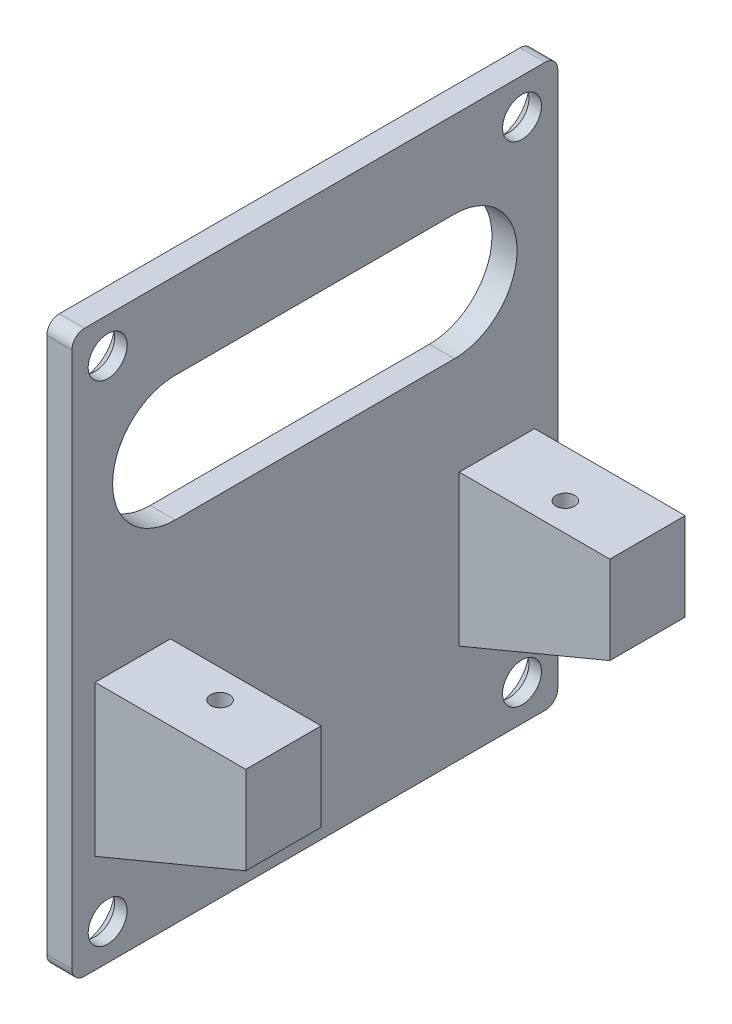
ISO-10303-21;
HEADER;
FILE_DESCRIPTION(('STEP AP214'),'2;1');
FILE_NAME('part.step','',(''),(''),'','','');
FILE_SCHEMA(('AUTOMOTIVE_DESIGN { 1 0 10303 214 1 1 1 1 }'));
ENDSEC;
DATA;
#1=APPLICATION_CONTEXT('core data for automotive mechanical design processes');
#2=APPLICATION_PROTOCOL_DEFINITION('international standard','automotive_design',2000,#1);
#3=PRODUCT_CONTEXT('',#1,'mechanical');
#4=PRODUCT('Part','Part','',(#3));
#5=PRODUCT_RELATED_PRODUCT_CATEGORY('part','',(#4));
#6=PRODUCT_DEFINITION_FORMATION('','',#4);
#7=PRODUCT_DEFINITION_CONTEXT('part definition',#1,'design');
#8=PRODUCT_DEFINITION('design','',#6,#7);
#9=PRODUCT_DEFINITION_SHAPE('','',#8);
#10=(LENGTH_UNIT() NAMED_UNIT(*) SI_UNIT(.MILLI.,.METRE.));
#11=(NAMED_UNIT(*) PLANE_ANGLE_UNIT() SI_UNIT($,.RADIAN.));
#12=(NAMED_UNIT(*) SI_UNIT($,.STERADIAN.) SOLID_ANGLE_UNIT());
#13=UNCERTAINTY_MEASURE_WITH_UNIT(LENGTH_MEASURE(1.E-05),#10,'distance_accuracy_value','');
#14=(GEOMETRIC_REPRESENTATION_CONTEXT(3) GLOBAL_UNCERTAINTY_ASSIGNED_CONTEXT((#13)) GLOBAL_UNIT_ASSIGNED_CONTEXT((#10,
#11,#12)) REPRESENTATION_CONTEXT('',''));
#15=CARTESIAN_POINT('',(0.,0.,0.));
#16=DIRECTION('',(0.,0.,1.));
#17=DIRECTION('',(1.,0.,0.));
#18=AXIS2_PLACEMENT_3D('',#15,#16,#17);
#19=CARTESIAN_POINT('',(2.,0.,0.));
#20=DIRECTION('',(1.,0.,0.));
#21=DIRECTION('',(0.,0.,-1.));
#22=AXIS2_PLACEMENT_3D('',#19,#20,#21);
#23=PLANE('',#22);
#24=DIRECTION('',(0.,1.,0.));
#25=VECTOR('',#24,1.);
#26=CARTESIAN_POINT('',(2.,-2.5,11.5));
#27=LINE('',#26,#25);
#28=CARTESIAN_POINT('',(2.,-14.5,11.5));
#29=VERTEX_POINT('',#28);
#30=CARTESIAN_POINT('',(2.,-2.5,11.5));
#31=VERTEX_POINT('',#30);
#32=EDGE_CURVE('E192',#29,#31,#27,.T.);
#33=ORIENTED_EDGE('',*,*,#32,.F.);
#34=DIRECTION('',(0.,0.,1.));
#35=VECTOR('',#34,1.);
#36=CARTESIAN_POINT('',(2.,-14.5,0.));
#37=LINE('',#36,#35);
#38=CARTESIAN_POINT('',(2.,-14.5,17.5));
#39=VERTEX_POINT('',#38);
#40=EDGE_CURVE('E204',#29,#39,#37,.T.);
#41=ORIENTED_EDGE('',*,*,#40,.T.);
#42=DIRECTION('',(0.,-1.,0.));
#43=VECTOR('',#42,1.);
#44=CARTESIAN_POINT('',(2.,-2.5,17.5));
#45=LINE('',#44,#43);
#46=CARTESIAN_POINT('',(2.,-2.5,17.5));
#47=VERTEX_POINT('',#46);
#48=EDGE_CURVE('E197',#47,#39,#45,.T.);
#49=ORIENTED_EDGE('',*,*,#48,.F.);
#50=DIRECTION('',(0.,0.,1.));
#51=VECTOR('',#50,1.);
#52=CARTESIAN_POINT('',(2.,-2.5,17.5));
#53=LINE('',#52,#51);
#54=EDGE_CURVE('E181',#31,#47,#53,.T.);
#55=ORIENTED_EDGE('',*,*,#54,.F.);
#56=EDGE_LOOP('',(#33,#41,#49,#55));
#57=FACE_BOUND('',#56,.T.);
#58=DIRECTION('',(0.,1.,0.));
#59=VECTOR('',#58,1.);
#60=CARTESIAN_POINT('',(2.,-2.5,-17.5));
#61=LINE('',#60,#59);
#62=CARTESIAN_POINT('',(2.,-14.5,-17.5));
#63=VERTEX_POINT('',#62);
#64=CARTESIAN_POINT('',(2.,-2.5,-17.5));
#65=VERTEX_POINT('',#64);
#66=EDGE_CURVE('E208',#63,#65,#61,.T.);
#67=ORIENTED_EDGE('',*,*,#66,.F.);
#68=DIRECTION('',(0.,0.,1.));
#69=VECTOR('',#68,1.);
#70=CARTESIAN_POINT('',(2.,-14.5,0.));
#71=LINE('',#70,#69);
#72=CARTESIAN_POINT('',(2.,-14.5,-11.5));
#73=VERTEX_POINT('',#72);
#74=EDGE_CURVE('E282',#63,#73,#71,.T.);
#75=ORIENTED_EDGE('',*,*,#74,.T.);
#76=DIRECTION('',(0.,-1.,0.));
#77=VECTOR('',#76,1.);
#78=CARTESIAN_POINT('',(2.,-2.5,-11.5));
#79=LINE('',#78,#77);
#80=CARTESIAN_POINT('',(2.,-2.5,-11.5));
#81=VERTEX_POINT('',#80);
#82=EDGE_CURVE('E206',#81,#73,#79,.T.);
#83=ORIENTED_EDGE('',*,*,#82,.F.);
#84=DIRECTION('',(0.,0.,1.));
#85=VECTOR('',#84,1.);
#86=CARTESIAN_POINT('',(2.,-2.5,-17.5));
#87=LINE('',#86,#85);
#88=EDGE_CURVE('E223',#65,#81,#87,.T.);
#89=ORIENTED_EDGE('',*,*,#88,.F.);
#90=EDGE_LOOP('',(#67,#75,#83,#89));
#91=FACE_BOUND('',#90,.T.);
#92=CARTESIAN_POINT('',(2.,19.5,16.5));
#93=DIRECTION('',(1.,0.,0.));
#94=DIRECTION('',(0.,0.,-1.));
#95=AXIS2_PLACEMENT_3D('',#92,#93,#94);
#96=CIRCLE('',#95,1.55);
#97=CARTESIAN_POINT('',(2.,19.5,14.95));
#98=VERTEX_POINT('',#97);
#99=EDGE_CURVE('E260',#98,#98,#96,.T.);
#100=ORIENTED_EDGE('',*,*,#99,.F.);
#101=EDGE_LOOP('',(#100));
#102=FACE_BOUND('',#101,.T.);
#103=CARTESIAN_POINT('',(2.,19.5,-16.5));
#104=DIRECTION('',(1.,0.,0.));
#105=DIRECTION('',(0.,0.,-1.));
#106=AXIS2_PLACEMENT_3D('',#103,#104,#105);
#107=CIRCLE('',#106,1.55);
#108=CARTESIAN_POINT('',(2.,19.5,-18.05));
#109=VERTEX_POINT('',#108);
#110=EDGE_CURVE('E257',#109,#109,#107,.T.);
#111=ORIENTED_EDGE('',*,*,#110,.F.);
#112=EDGE_LOOP('',(#111));
#113=FACE_BOUND('',#112,.T.);
#114=CARTESIAN_POINT('',(2.,-19.5,-16.5));
#115=DIRECTION('',(1.,0.,0.));
#116=DIRECTION('',(0.,0.,-1.));
#117=AXIS2_PLACEMENT_3D('',#114,#115,#116);
#118=CIRCLE('',#117,1.55);
#119=CARTESIAN_POINT('',(2.,-19.5,-18.05));
#120=VERTEX_POINT('',#119);
#121=EDGE_CURVE('E254',#120,#120,#118,.T.);
#122=ORIENTED_EDGE('',*,*,#121,.F.);
#123=EDGE_LOOP('',(#122));
#124=FACE_BOUND('',#123,.T.);
#125=CARTESIAN_POINT('',(2.,10.5,-11.1189551552373));
#126=DIRECTION('',(1.,0.,0.));
#127=DIRECTION('',(0.,0.,-1.));
#128=AXIS2_PLACEMENT_3D('',#125,#126,#127);
#129=CIRCLE('',#128,4.98965791573823);
#130=CARTESIAN_POINT('',(2.,5.51034208426177,-11.1189551552373));
#131=VERTEX_POINT('',#130);
#132=CARTESIAN_POINT('',(2.,15.4896579157382,-11.1189551552373));
#133=VERTEX_POINT('',#132);
#134=EDGE_CURVE('E242',#131,#133,#129,.T.);
#135=ORIENTED_EDGE('',*,*,#134,.F.);
#136=DIRECTION('',(0.,0.,-1.));
#137=VECTOR('',#136,1.);
#138=CARTESIAN_POINT('',(2.,5.51034208426177,0.));
#139=LINE('',#138,#137);
#140=CARTESIAN_POINT('',(2.,5.51034208426177,11.1189551552373));
#141=VERTEX_POINT('',#140);
#142=EDGE_CURVE('E246',#141,#131,#139,.T.);
#143=ORIENTED_EDGE('',*,*,#142,.F.);
#144=CARTESIAN_POINT('',(2.,10.5,11.1189551552373));
#145=DIRECTION('',(1.,0.,0.));
#146=DIRECTION('',(0.,0.,-1.));
#147=AXIS2_PLACEMENT_3D('',#144,#145,#146);
#148=CIRCLE('',#147,4.98965791573823);
#149=CARTESIAN_POINT('',(2.,15.4896579157382,11.1189551552373));
#150=VERTEX_POINT('',#149);
#151=EDGE_CURVE('E249',#150,#141,#148,.T.);
#152=ORIENTED_EDGE('',*,*,#151,.F.);
#153=DIRECTION('',(0.,0.,-1.));
#154=VECTOR('',#153,1.);
#155=CARTESIAN_POINT('',(2.,15.4896579157382,0.));
#156=LINE('',#155,#154);
#157=EDGE_CURVE('E252',#150,#133,#156,.T.);
#158=ORIENTED_EDGE('',*,*,#157,.T.);
#159=EDGE_LOOP('',(#135,#143,#152,#158));
#160=FACE_BOUND('',#159,.T.);
#161=CARTESIAN_POINT('',(2.,-19.5,16.5));
#162=DIRECTION('',(1.,0.,0.));
#163=DIRECTION('',(0.,0.,-1.));
#164=AXIS2_PLACEMENT_3D('',#161,#162,#163);
#165=CIRCLE('',#164,1.55);
#166=CARTESIAN_POINT('',(2.,-19.5,14.95));
#167=VERTEX_POINT('',#166);
#168=EDGE_CURVE('E239',#167,#167,#165,.T.);
#169=ORIENTED_EDGE('',*,*,#168,.F.);
#170=EDGE_LOOP('',(#169));
#171=FACE_BOUND('',#170,.T.);
#172=DIRECTION('',(0.,-1.,0.));
#173=VECTOR('',#172,1.);
#174=CARTESIAN_POINT('',(2.,0.,19.35));
#175=LINE('',#174,#173);
#176=CARTESIAN_POINT('',(2.,21.35,19.35));
#177=VERTEX_POINT('',#176);
#178=CARTESIAN_POINT('',(2.,-21.35,19.35));
#179=VERTEX_POINT('',#178);
#180=EDGE_CURVE('E397',#177,#179,#175,.T.);
#181=ORIENTED_EDGE('',*,*,#180,.T.);
#182=CARTESIAN_POINT('',(2.,-21.35,18.35));
#183=DIRECTION('',(1.,0.,0.));
#184=DIRECTION('',(0.,0.,-1.));
#185=AXIS2_PLACEMENT_3D('',#182,#183,#184);
#186=CIRCLE('',#185,1.);
#187=CARTESIAN_POINT('',(2.,-22.35,18.35));
#188=VERTEX_POINT('',#187);
#189=EDGE_CURVE('E315',#179,#188,#186,.T.);
#190=ORIENTED_EDGE('',*,*,#189,.T.);
#191=DIRECTION('',(0.,0.,-1.));
#192=VECTOR('',#191,1.);
#193=CARTESIAN_POINT('',(2.,-22.35,0.));
#194=LINE('',#193,#192);
#195=CARTESIAN_POINT('',(2.,-22.35,-18.35));
#196=VERTEX_POINT('',#195);
#197=EDGE_CURVE('E403',#188,#196,#194,.T.);
#198=ORIENTED_EDGE('',*,*,#197,.T.);
#199=CARTESIAN_POINT('',(2.,-21.35,-18.35));
#200=DIRECTION('',(1.,0.,0.));
#201=DIRECTION('',(0.,0.,-1.));
#202=AXIS2_PLACEMENT_3D('',#199,#200,#201);
#203=CIRCLE('',#202,1.);
#204=CARTESIAN_POINT('',(2.,-21.35,-19.35));
#205=VERTEX_POINT('',#204);
#206=EDGE_CURVE('E313',#196,#205,#203,.T.);
#207=ORIENTED_EDGE('',*,*,#206,.T.);
#208=DIRECTION('',(0.,1.,0.));
#209=VECTOR('',#208,1.);
#210=CARTESIAN_POINT('',(2.,0.,-19.35));
#211=LINE('',#210,#209);
#212=CARTESIAN_POINT('',(2.,21.35,-19.35));
#213=VERTEX_POINT('',#212);
#214=EDGE_CURVE('E405',#205,#213,#211,.T.);
#215=ORIENTED_EDGE('',*,*,#214,.T.);
#216=CARTESIAN_POINT('',(2.,21.35,-18.35));
#217=DIRECTION('',(1.,0.,0.));
#218=DIRECTION('',(0.,0.,-1.));
#219=AXIS2_PLACEMENT_3D('',#216,#217,#218);
#220=CIRCLE('',#219,1.);
#221=CARTESIAN_POINT('',(2.,22.35,-18.35));
#222=VERTEX_POINT('',#221);
#223=EDGE_CURVE('E309',#213,#222,#220,.T.);
#224=ORIENTED_EDGE('',*,*,#223,.T.);
#225=DIRECTION('',(0.,0.,1.));
#226=VECTOR('',#225,1.);
#227=CARTESIAN_POINT('',(2.,22.35,0.));
#228=LINE('',#227,#226);
#229=CARTESIAN_POINT('',(2.,22.35,18.35));
#230=VERTEX_POINT('',#229);
#231=EDGE_CURVE('E300',#222,#230,#228,.T.);
#232=ORIENTED_EDGE('',*,*,#231,.T.);
#233=CARTESIAN_POINT('',(2.,21.35,18.35));
#234=DIRECTION('',(1.,0.,0.));
#235=DIRECTION('',(0.,0.,-1.));
#236=AXIS2_PLACEMENT_3D('',#233,#234,#235);
#237=CIRCLE('',#236,1.);
#238=EDGE_CURVE('E311',#230,#177,#237,.T.);
#239=ORIENTED_EDGE('',*,*,#238,.T.);
#240=EDGE_LOOP('',(#181,#190,#198,#207,#215,#224,#232,#239));
#241=FACE_BOUND('',#240,.T.);
#242=ADVANCED_FACE('F41',(#57,#91,#102,#113,#124,#160,#171,#241),#23,.T.);
#243=CARTESIAN_POINT('',(0.,0.,0.));
#244=DIRECTION('',(1.,0.,0.));
#245=DIRECTION('',(0.,0.,-1.));
#246=AXIS2_PLACEMENT_3D('',#243,#244,#245);
#247=PLANE('',#246);
#248=CARTESIAN_POINT('',(0.,19.5,16.5));
#249=DIRECTION('',(1.,0.,0.));
#250=DIRECTION('',(0.,0.,-1.));
#251=AXIS2_PLACEMENT_3D('',#248,#249,#250);
#252=CIRCLE('',#251,2.55);
#253=CARTESIAN_POINT('',(0.,19.5,13.95));
#254=VERTEX_POINT('',#253);
#255=EDGE_CURVE('E347',#254,#254,#252,.T.);
#256=ORIENTED_EDGE('',*,*,#255,.T.);
#257=EDGE_LOOP('',(#256));
#258=FACE_BOUND('',#257,.T.);
#259=CARTESIAN_POINT('',(0.,19.5,-16.5));
#260=DIRECTION('',(1.,0.,0.));
#261=DIRECTION('',(0.,0.,-1.));
#262=AXIS2_PLACEMENT_3D('',#259,#260,#261);
#263=CIRCLE('',#262,2.55);
#264=CARTESIAN_POINT('',(0.,19.5,-19.05));
#265=VERTEX_POINT('',#264);
#266=EDGE_CURVE('E344',#265,#265,#263,.T.);
#267=ORIENTED_EDGE('',*,*,#266,.T.);
#268=EDGE_LOOP('',(#267));
#269=FACE_BOUND('',#268,.T.);
#270=CARTESIAN_POINT('',(0.,-19.5,-16.5));
#271=DIRECTION('',(1.,0.,0.));
#272=DIRECTION('',(0.,0.,-1.));
#273=AXIS2_PLACEMENT_3D('',#270,#271,#272);
#274=CIRCLE('',#273,2.55);
#275=CARTESIAN_POINT('',(0.,-19.5,-19.05));
#276=VERTEX_POINT('',#275);
#277=EDGE_CURVE('E341',#276,#276,#274,.T.);
#278=ORIENTED_EDGE('',*,*,#277,.T.);
#279=EDGE_LOOP('',(#278));
#280=FACE_BOUND('',#279,.T.);
#281=CARTESIAN_POINT('',(0.,-19.5,16.5));
#282=DIRECTION('',(1.,0.,0.));
#283=DIRECTION('',(0.,0.,-1.));
#284=AXIS2_PLACEMENT_3D('',#281,#282,#283);
#285=CIRCLE('',#284,2.55);
#286=CARTESIAN_POINT('',(0.,-19.5,13.95));
#287=VERTEX_POINT('',#286);
#288=EDGE_CURVE('E338',#287,#287,#285,.T.);
#289=ORIENTED_EDGE('',*,*,#288,.T.);
#290=EDGE_LOOP('',(#289));
#291=FACE_BOUND('',#290,.T.);
#292=CARTESIAN_POINT('',(0.,10.5,-11.1189551552373));
#293=DIRECTION('',(1.,0.,0.));
#294=DIRECTION('',(0.,0.,-1.));
#295=AXIS2_PLACEMENT_3D('',#292,#293,#294);
#296=CIRCLE('',#295,4.98965791573823);
#297=CARTESIAN_POINT('',(0.,5.51034208426177,-11.1189551552373));
#298=VERTEX_POINT('',#297);
#299=CARTESIAN_POINT('',(0.,15.4896579157382,-11.1189551552373));
#300=VERTEX_POINT('',#299);
#301=EDGE_CURVE('E238',#298,#300,#296,.T.);
#302=ORIENTED_EDGE('',*,*,#301,.T.);
#303=DIRECTION('',(0.,0.,-1.));
#304=VECTOR('',#303,1.);
#305=CARTESIAN_POINT('',(0.,15.4896579157382,0.));
#306=LINE('',#305,#304);
#307=CARTESIAN_POINT('',(0.,15.4896579157382,11.1189551552373));
#308=VERTEX_POINT('',#307);
#309=EDGE_CURVE('E243',#308,#300,#306,.T.);
#310=ORIENTED_EDGE('',*,*,#309,.F.);
#311=CARTESIAN_POINT('',(0.,10.5,11.1189551552373));
#312=DIRECTION('',(1.,0.,0.));
#313=DIRECTION('',(0.,0.,-1.));
#314=AXIS2_PLACEMENT_3D('',#311,#312,#313);
#315=CIRCLE('',#314,4.98965791573823);
#316=CARTESIAN_POINT('',(0.,5.51034208426177,11.1189551552373));
#317=VERTEX_POINT('',#316);
#318=EDGE_CURVE('E269',#308,#317,#315,.T.);
#319=ORIENTED_EDGE('',*,*,#318,.T.);
#320=DIRECTION('',(0.,0.,-1.));
#321=VECTOR('',#320,1.);
#322=CARTESIAN_POINT('',(0.,5.51034208426177,0.));
#323=LINE('',#322,#321);
#324=EDGE_CURVE('E266',#317,#298,#323,.T.);
#325=ORIENTED_EDGE('',*,*,#324,.T.);
#326=EDGE_LOOP('',(#302,#310,#319,#325));
#327=FACE_BOUND('',#326,.T.);
#328=DIRECTION('',(0.,0.,-1.));
#329=VECTOR('',#328,1.);
#330=CARTESIAN_POINT('',(0.,-22.35,-19.35));
#331=LINE('',#330,#329);
#332=CARTESIAN_POINT('',(0.,-22.35,18.35));
#333=VERTEX_POINT('',#332);
#334=CARTESIAN_POINT('',(0.,-22.35,-18.35));
#335=VERTEX_POINT('',#334);
#336=EDGE_CURVE('E379',#333,#335,#331,.T.);
#337=ORIENTED_EDGE('',*,*,#336,.F.);
#338=CARTESIAN_POINT('',(0.,-21.35,18.35));
#339=DIRECTION('',(1.,0.,0.));
#340=DIRECTION('',(0.,0.,-1.));
#341=AXIS2_PLACEMENT_3D('',#338,#339,#340);
#342=CIRCLE('',#341,1.);
#343=CARTESIAN_POINT('',(0.,-21.35,19.35));
#344=VERTEX_POINT('',#343);
#345=EDGE_CURVE('E327',#333,#344,#342,.F.);
#346=ORIENTED_EDGE('',*,*,#345,.T.);
#347=DIRECTION('',(0.,-1.,0.));
#348=VECTOR('',#347,1.);
#349=CARTESIAN_POINT('',(0.,-22.35,19.35));
#350=LINE('',#349,#348);
#351=CARTESIAN_POINT('',(0.,21.35,19.35));
#352=VERTEX_POINT('',#351);
#353=EDGE_CURVE('E387',#352,#344,#350,.T.);
#354=ORIENTED_EDGE('',*,*,#353,.F.);
#355=CARTESIAN_POINT('',(0.,21.35,18.35));
#356=DIRECTION('',(1.,0.,0.));
#357=DIRECTION('',(0.,0.,-1.));
#358=AXIS2_PLACEMENT_3D('',#355,#356,#357);
#359=CIRCLE('',#358,1.);
#360=CARTESIAN_POINT('',(0.,22.35,18.35));
#361=VERTEX_POINT('',#360);
#362=EDGE_CURVE('E323',#352,#361,#359,.F.);
#363=ORIENTED_EDGE('',*,*,#362,.T.);
#364=DIRECTION('',(0.,0.,1.));
#365=VECTOR('',#364,1.);
#366=CARTESIAN_POINT('',(0.,22.35,19.35));
#367=LINE('',#366,#365);
#368=CARTESIAN_POINT('',(0.,22.35,-18.35));
#369=VERTEX_POINT('',#368);
#370=EDGE_CURVE('E859',#369,#361,#367,.T.);
#371=ORIENTED_EDGE('',*,*,#370,.F.);
#372=CARTESIAN_POINT('',(0.,21.35,-18.35));
#373=DIRECTION('',(1.,0.,0.));
#374=DIRECTION('',(0.,0.,-1.));
#375=AXIS2_PLACEMENT_3D('',#372,#373,#374);
#376=CIRCLE('',#375,1.);
#377=CARTESIAN_POINT('',(0.,21.35,-19.35));
#378=VERTEX_POINT('',#377);
#379=EDGE_CURVE('E57',#369,#378,#376,.F.);
#380=ORIENTED_EDGE('',*,*,#379,.T.);
#381=DIRECTION('',(0.,1.,0.));
#382=VECTOR('',#381,1.);
#383=CARTESIAN_POINT('',(0.,22.35,-19.35));
#384=LINE('',#383,#382);
#385=CARTESIAN_POINT('',(0.,-21.35,-19.35));
#386=VERTEX_POINT('',#385);
#387=EDGE_CURVE('E386',#386,#378,#384,.T.);
#388=ORIENTED_EDGE('',*,*,#387,.F.);
#389=CARTESIAN_POINT('',(0.,-21.35,-18.35));
#390=DIRECTION('',(1.,0.,0.));
#391=DIRECTION('',(0.,0.,-1.));
#392=AXIS2_PLACEMENT_3D('',#389,#390,#391);
#393=CIRCLE('',#392,1.);
#394=EDGE_CURVE('E325',#386,#335,#393,.F.);
#395=ORIENTED_EDGE('',*,*,#394,.T.);
#396=EDGE_LOOP('',(#337,#346,#354,#363,#371,#380,#388,#395));
#397=FACE_BOUND('',#396,.T.);
#398=ADVANCED_FACE('F367',(#258,#269,#280,#291,#327,#397),#247,.F.);
#399=CARTESIAN_POINT('',(2.,10.5,-11.1189551552373));
#400=DIRECTION('',(-1.,0.,0.));
#401=DIRECTION('',(0.,0.,1.));
#402=AXIS2_PLACEMENT_3D('',#399,#400,#401);
#403=CYLINDRICAL_SURFACE('',#402,4.98965791573823);
#404=ORIENTED_EDGE('',*,*,#301,.F.);
#405=DIRECTION('',(-1.,0.,0.));
#406=VECTOR('',#405,1.);
#407=CARTESIAN_POINT('',(2.,5.51034208426177,-11.1189551552373));
#408=LINE('',#407,#406);
#409=EDGE_CURVE('E279',#131,#298,#408,.T.);
#410=ORIENTED_EDGE('',*,*,#409,.F.);
#411=ORIENTED_EDGE('',*,*,#134,.T.);
#412=DIRECTION('',(-1.,0.,0.));
#413=VECTOR('',#412,1.);
#414=CARTESIAN_POINT('',(2.,15.4896579157382,-11.1189551552373));
#415=LINE('',#414,#413);
#416=EDGE_CURVE('E263',#133,#300,#415,.T.);
#417=ORIENTED_EDGE('',*,*,#416,.T.);
#418=EDGE_LOOP('',(#404,#410,#411,#417));
#419=FACE_BOUND('',#418,.T.);
#420=ADVANCED_FACE('F370',(#419),#403,.F.);
#421=CARTESIAN_POINT('',(2.,5.51034208426177,0.));
#422=DIRECTION('',(0.,1.,0.));
#423=DIRECTION('',(0.,0.,1.));
#424=AXIS2_PLACEMENT_3D('',#421,#422,#423);
#425=PLANE('',#424);
#426=ORIENTED_EDGE('',*,*,#324,.F.);
#427=DIRECTION('',(-1.,0.,0.));
#428=VECTOR('',#427,1.);
#429=CARTESIAN_POINT('',(2.,5.51034208426177,11.1189551552373));
#430=LINE('',#429,#428);
#431=EDGE_CURVE('E277',#141,#317,#430,.T.);
#432=ORIENTED_EDGE('',*,*,#431,.F.);
#433=ORIENTED_EDGE('',*,*,#142,.T.);
#434=ORIENTED_EDGE('',*,*,#409,.T.);
#435=EDGE_LOOP('',(#426,#432,#433,#434));
#436=FACE_BOUND('',#435,.T.);
#437=ADVANCED_FACE('F472',(#436),#425,.T.);
#438=CARTESIAN_POINT('',(2.,10.5,11.1189551552373));
#439=DIRECTION('',(-1.,0.,0.));
#440=DIRECTION('',(0.,0.,1.));
#441=AXIS2_PLACEMENT_3D('',#438,#439,#440);
#442=CYLINDRICAL_SURFACE('',#441,4.98965791573823);
#443=ORIENTED_EDGE('',*,*,#318,.F.);
#444=DIRECTION('',(-1.,0.,0.));
#445=VECTOR('',#444,1.);
#446=CARTESIAN_POINT('',(2.,15.4896579157382,11.1189551552373));
#447=LINE('',#446,#445);
#448=EDGE_CURVE('E275',#150,#308,#447,.T.);
#449=ORIENTED_EDGE('',*,*,#448,.F.);
#450=ORIENTED_EDGE('',*,*,#151,.T.);
#451=ORIENTED_EDGE('',*,*,#431,.T.);
#452=EDGE_LOOP('',(#443,#449,#450,#451));
#453=FACE_BOUND('',#452,.T.);
#454=ADVANCED_FACE('F459',(#453),#442,.F.);
#455=CARTESIAN_POINT('',(2.,19.5,16.5));
#456=DIRECTION('',(-1.,0.,0.));
#457=DIRECTION('',(0.,0.,1.));
#458=AXIS2_PLACEMENT_3D('',#455,#456,#457);
#459=CYLINDRICAL_SURFACE('',#458,1.55);
#460=CARTESIAN_POINT('',(1.00000000000001,19.5,16.5));
#461=DIRECTION('',(1.,0.,0.));
#462=DIRECTION('',(0.,0.,-1.));
#463=AXIS2_PLACEMENT_3D('',#460,#461,#462);
#464=CIRCLE('',#463,1.55);
#465=CARTESIAN_POINT('',(1.00000000000001,19.5,14.95));
#466=VERTEX_POINT('',#465);
#467=EDGE_CURVE('E350',#466,#466,#464,.F.);
#468=ORIENTED_EDGE('',*,*,#467,.T.);
#469=EDGE_LOOP('',(#468));
#470=FACE_BOUND('',#469,.T.);
#471=ORIENTED_EDGE('',*,*,#99,.T.);
#472=EDGE_LOOP('',(#471));
#473=FACE_BOUND('',#472,.T.);
#474=ADVANCED_FACE('F455',(#470,#473),#459,.F.);
#475=CARTESIAN_POINT('',(2.,19.5,-16.5));
#476=DIRECTION('',(-1.,0.,0.));
#477=DIRECTION('',(0.,0.,1.));
#478=AXIS2_PLACEMENT_3D('',#475,#476,#477);
#479=CYLINDRICAL_SURFACE('',#478,1.55);
#480=CARTESIAN_POINT('',(1.00000000000001,19.5,-16.5));
#481=DIRECTION('',(1.,0.,0.));
#482=DIRECTION('',(0.,0.,-1.));
#483=AXIS2_PLACEMENT_3D('',#480,#481,#482);
#484=CIRCLE('',#483,1.55);
#485=CARTESIAN_POINT('',(1.00000000000001,19.5,-18.05));
#486=VERTEX_POINT('',#485);
#487=EDGE_CURVE('E353',#486,#486,#484,.F.);
#488=ORIENTED_EDGE('',*,*,#487,.T.);
#489=EDGE_LOOP('',(#488));
#490=FACE_BOUND('',#489,.T.);
#491=ORIENTED_EDGE('',*,*,#110,.T.);
#492=EDGE_LOOP('',(#491));
#493=FACE_BOUND('',#492,.T.);
#494=ADVANCED_FACE('F458',(#490,#493),#479,.F.);
#495=CARTESIAN_POINT('',(2.,-19.5,-16.5));
#496=DIRECTION('',(-1.,0.,0.));
#497=DIRECTION('',(0.,0.,1.));
#498=AXIS2_PLACEMENT_3D('',#495,#496,#497);
#499=CYLINDRICAL_SURFACE('',#498,1.55);
#500=CARTESIAN_POINT('',(1.00000000000001,-19.5,-16.5));
#501=DIRECTION('',(1.,0.,0.));
#502=DIRECTION('',(0.,0.,-1.));
#503=AXIS2_PLACEMENT_3D('',#500,#501,#502);
#504=CIRCLE('',#503,1.55);
#505=CARTESIAN_POINT('',(1.00000000000001,-19.5,-18.05));
#506=VERTEX_POINT('',#505);
#507=EDGE_CURVE('E50',#506,#506,#504,.F.);
#508=ORIENTED_EDGE('',*,*,#507,.T.);
#509=EDGE_LOOP('',(#508));
#510=FACE_BOUND('',#509,.T.);
#511=ORIENTED_EDGE('',*,*,#121,.T.);
#512=EDGE_LOOP('',(#511));
#513=FACE_BOUND('',#512,.T.);
#514=ADVANCED_FACE('F358',(#510,#513),#499,.F.);
#515=CARTESIAN_POINT('',(2.,15.4896579157382,0.));
#516=DIRECTION('',(0.,1.,0.));
#517=DIRECTION('',(0.,0.,1.));
#518=AXIS2_PLACEMENT_3D('',#515,#516,#517);
#519=PLANE('',#518);
#520=ORIENTED_EDGE('',*,*,#309,.T.);
#521=ORIENTED_EDGE('',*,*,#416,.F.);
#522=ORIENTED_EDGE('',*,*,#157,.F.);
#523=ORIENTED_EDGE('',*,*,#448,.T.);
#524=EDGE_LOOP('',(#520,#521,#522,#523));
#525=FACE_BOUND('',#524,.T.);
#526=ADVANCED_FACE('F466',(#525),#519,.F.);
#527=CARTESIAN_POINT('',(2.,-19.5,16.5));
#528=DIRECTION('',(-1.,0.,0.));
#529=DIRECTION('',(0.,0.,1.));
#530=AXIS2_PLACEMENT_3D('',#527,#528,#529);
#531=CYLINDRICAL_SURFACE('',#530,1.55);
#532=CARTESIAN_POINT('',(1.00000000000001,-19.5,16.5));
#533=DIRECTION('',(1.,0.,0.));
#534=DIRECTION('',(0.,0.,-1.));
#535=AXIS2_PLACEMENT_3D('',#532,#533,#534);
#536=CIRCLE('',#535,1.55);
#537=CARTESIAN_POINT('',(1.00000000000001,-19.5,14.95));
#538=VERTEX_POINT('',#537);
#539=EDGE_CURVE('E11',#538,#538,#536,.F.);
#540=ORIENTED_EDGE('',*,*,#539,.T.);
#541=EDGE_LOOP('',(#540));
#542=FACE_BOUND('',#541,.T.);
#543=ORIENTED_EDGE('',*,*,#168,.T.);
#544=EDGE_LOOP('',(#543));
#545=FACE_BOUND('',#544,.T.);
#546=ADVANCED_FACE('F448',(#542,#545),#531,.F.);
#547=CARTESIAN_POINT('',(14.,-2.5,-11.5));
#548=DIRECTION('',(0.,0.,-1.));
#549=DIRECTION('',(-1.,0.,0.));
#550=AXIS2_PLACEMENT_3D('',#547,#548,#549);
#551=PLANE('',#550);
#552=ORIENTED_EDGE('',*,*,#82,.T.);
#553=DIRECTION('',(0.923076923076922,0.384615384615387,0.));
#554=VECTOR('',#553,1.);
#555=CARTESIAN_POINT('',(16.4852071005917,-8.46449704142007,-11.5));
#556=LINE('',#555,#554);
#557=CARTESIAN_POINT('',(14.,-9.5,-11.5));
#558=VERTEX_POINT('',#557);
#559=EDGE_CURVE('E288',#73,#558,#556,.T.);
#560=ORIENTED_EDGE('',*,*,#559,.T.);
#561=DIRECTION('',(0.,-1.,0.));
#562=VECTOR('',#561,1.);
#563=CARTESIAN_POINT('',(14.,-2.5,-11.5));
#564=LINE('',#563,#562);
#565=CARTESIAN_POINT('',(14.,-2.5,-11.5));
#566=VERTEX_POINT('',#565);
#567=EDGE_CURVE('E219',#566,#558,#564,.T.);
#568=ORIENTED_EDGE('',*,*,#567,.F.);
#569=DIRECTION('',(-1.,0.,0.));
#570=VECTOR('',#569,1.);
#571=CARTESIAN_POINT('',(14.,-2.5,-11.5));
#572=LINE('',#571,#570);
#573=EDGE_CURVE('E229',#566,#81,#572,.T.);
#574=ORIENTED_EDGE('',*,*,#573,.T.);
#575=EDGE_LOOP('',(#552,#560,#568,#574));
#576=FACE_BOUND('',#575,.T.);
#577=ADVANCED_FACE('F433',(#576),#551,.F.);
#578=CARTESIAN_POINT('',(14.,-2.5,-17.5));
#579=DIRECTION('',(0.,0.,1.));
#580=DIRECTION('',(1.,0.,0.));
#581=AXIS2_PLACEMENT_3D('',#578,#579,#580);
#582=PLANE('',#581);
#583=ORIENTED_EDGE('',*,*,#66,.T.);
#584=DIRECTION('',(-1.,0.,0.));
#585=VECTOR('',#584,1.);
#586=CARTESIAN_POINT('',(14.,-2.5,-17.5));
#587=LINE('',#586,#585);
#588=CARTESIAN_POINT('',(14.,-2.5,-17.5));
#589=VERTEX_POINT('',#588);
#590=EDGE_CURVE('E236',#589,#65,#587,.T.);
#591=ORIENTED_EDGE('',*,*,#590,.F.);
#592=DIRECTION('',(0.,1.,0.));
#593=VECTOR('',#592,1.);
#594=CARTESIAN_POINT('',(14.,-2.5,-17.5));
#595=LINE('',#594,#593);
#596=CARTESIAN_POINT('',(14.,-9.5,-17.5));
#597=VERTEX_POINT('',#596);
#598=EDGE_CURVE('E226',#597,#589,#595,.T.);
#599=ORIENTED_EDGE('',*,*,#598,.F.);
#600=DIRECTION('',(-0.923076923076922,-0.384615384615387,0.));
#601=VECTOR('',#600,1.);
#602=CARTESIAN_POINT('',(16.4852071005917,-8.46449704142007,-17.5));
#603=LINE('',#602,#601);
#604=EDGE_CURVE('E285',#597,#63,#603,.T.);
#605=ORIENTED_EDGE('',*,*,#604,.T.);
#606=EDGE_LOOP('',(#583,#591,#599,#605));
#607=FACE_BOUND('',#606,.T.);
#608=ADVANCED_FACE('F424',(#607),#582,.F.);
#609=CARTESIAN_POINT('',(14.,-2.5,-17.5));
#610=DIRECTION('',(0.,-1.,0.));
#611=DIRECTION('',(0.,0.,-1.));
#612=AXIS2_PLACEMENT_3D('',#609,#610,#611);
#613=PLANE('',#612);
#614=CARTESIAN_POINT('',(8.2,-2.5,-13.75));
#615=DIRECTION('',(0.,-1.,0.));
#616=DIRECTION('',(0.,0.,-1.));
#617=AXIS2_PLACEMENT_3D('',#614,#615,#616);
#618=CIRCLE('',#617,0.749999999999998);
#619=CARTESIAN_POINT('',(8.2,-2.5,-14.5));
#620=VERTEX_POINT('',#619);
#621=EDGE_CURVE('E304',#620,#620,#618,.F.);
#622=ORIENTED_EDGE('',*,*,#621,.F.);
#623=EDGE_LOOP('',(#622));
#624=FACE_BOUND('',#623,.T.);
#625=ORIENTED_EDGE('',*,*,#88,.T.);
#626=ORIENTED_EDGE('',*,*,#573,.F.);
#627=DIRECTION('',(0.,0.,1.));
#628=VECTOR('',#627,1.);
#629=CARTESIAN_POINT('',(14.,-2.5,-17.5));
#630=LINE('',#629,#628);
#631=EDGE_CURVE('E228',#589,#566,#630,.T.);
#632=ORIENTED_EDGE('',*,*,#631,.F.);
#633=ORIENTED_EDGE('',*,*,#590,.T.);
#634=EDGE_LOOP('',(#625,#626,#632,#633));
#635=FACE_BOUND('',#634,.T.);
#636=ADVANCED_FACE('F420',(#624,#635),#613,.F.);
#637=CARTESIAN_POINT('',(14.,0.,0.));
#638=DIRECTION('',(-1.,0.,0.));
#639=DIRECTION('',(0.,0.,1.));
#640=AXIS2_PLACEMENT_3D('',#637,#638,#639);
#641=PLANE('',#640);
#642=ORIENTED_EDGE('',*,*,#567,.T.);
#643=DIRECTION('',(0.,0.,-1.));
#644=VECTOR('',#643,1.);
#645=CARTESIAN_POINT('',(14.,-9.5,-17.5));
#646=LINE('',#645,#644);
#647=EDGE_CURVE('E222',#558,#597,#646,.T.);
#648=ORIENTED_EDGE('',*,*,#647,.T.);
#649=ORIENTED_EDGE('',*,*,#598,.T.);
#650=ORIENTED_EDGE('',*,*,#631,.T.);
#651=EDGE_LOOP('',(#642,#648,#649,#650));
#652=FACE_BOUND('',#651,.T.);
#653=ADVANCED_FACE('F423',(#652),#641,.F.);
#654=CARTESIAN_POINT('',(14.,-2.5,17.5));
#655=DIRECTION('',(0.,0.,-1.));
#656=DIRECTION('',(-1.,0.,0.));
#657=AXIS2_PLACEMENT_3D('',#654,#655,#656);
#658=PLANE('',#657);
#659=ORIENTED_EDGE('',*,*,#48,.T.);
#660=DIRECTION('',(0.923076923076922,0.384615384615387,0.));
#661=VECTOR('',#660,1.);
#662=CARTESIAN_POINT('',(16.4852071005917,-8.46449704142007,17.5));
#663=LINE('',#662,#661);
#664=CARTESIAN_POINT('',(14.,-9.5,17.5));
#665=VERTEX_POINT('',#664);
#666=EDGE_CURVE('E293',#39,#665,#663,.T.);
#667=ORIENTED_EDGE('',*,*,#666,.T.);
#668=DIRECTION('',(0.,-1.,0.));
#669=VECTOR('',#668,1.);
#670=CARTESIAN_POINT('',(14.,-2.5,17.5));
#671=LINE('',#670,#669);
#672=CARTESIAN_POINT('',(14.,-2.5,17.5));
#673=VERTEX_POINT('',#672);
#674=EDGE_CURVE('E193',#673,#665,#671,.T.);
#675=ORIENTED_EDGE('',*,*,#674,.F.);
#676=DIRECTION('',(-1.,0.,0.));
#677=VECTOR('',#676,1.);
#678=CARTESIAN_POINT('',(14.,-2.5,17.5));
#679=LINE('',#678,#677);
#680=EDGE_CURVE('E185',#673,#47,#679,.T.);
#681=ORIENTED_EDGE('',*,*,#680,.T.);
#682=EDGE_LOOP('',(#659,#667,#675,#681));
#683=FACE_BOUND('',#682,.T.);
#684=ADVANCED_FACE('F196',(#683),#658,.F.);
#685=CARTESIAN_POINT('',(14.,-2.5,11.5));
#686=DIRECTION('',(0.,0.,1.));
#687=DIRECTION('',(1.,0.,0.));
#688=AXIS2_PLACEMENT_3D('',#685,#686,#687);
#689=PLANE('',#688);
#690=ORIENTED_EDGE('',*,*,#32,.T.);
#691=DIRECTION('',(-1.,0.,0.));
#692=VECTOR('',#691,1.);
#693=CARTESIAN_POINT('',(14.,-2.5,11.5));
#694=LINE('',#693,#692);
#695=CARTESIAN_POINT('',(14.,-2.5,11.5));
#696=VERTEX_POINT('',#695);
#697=EDGE_CURVE('E188',#696,#31,#694,.T.);
#698=ORIENTED_EDGE('',*,*,#697,.F.);
#699=DIRECTION('',(0.,1.,0.));
#700=VECTOR('',#699,1.);
#701=CARTESIAN_POINT('',(14.,-2.5,11.5));
#702=LINE('',#701,#700);
#703=CARTESIAN_POINT('',(14.,-9.5,11.5));
#704=VERTEX_POINT('',#703);
#705=EDGE_CURVE('E213',#704,#696,#702,.T.);
#706=ORIENTED_EDGE('',*,*,#705,.F.);
#707=DIRECTION('',(-0.923076923076922,-0.384615384615387,0.));
#708=VECTOR('',#707,1.);
#709=CARTESIAN_POINT('',(16.4852071005917,-8.46449704142007,11.5));
#710=LINE('',#709,#708);
#711=EDGE_CURVE('E290',#704,#29,#710,.T.);
#712=ORIENTED_EDGE('',*,*,#711,.T.);
#713=EDGE_LOOP('',(#690,#698,#706,#712));
#714=FACE_BOUND('',#713,.T.);
#715=ADVANCED_FACE('F716',(#714),#689,.F.);
#716=CARTESIAN_POINT('',(14.,-2.5,17.5));
#717=DIRECTION('',(0.,-1.,0.));
#718=DIRECTION('',(0.,0.,-1.));
#719=AXIS2_PLACEMENT_3D('',#716,#717,#718);
#720=PLANE('',#719);
#721=CARTESIAN_POINT('',(8.2,-2.5,13.75));
#722=DIRECTION('',(0.,-1.,0.));
#723=DIRECTION('',(0.,0.,-1.));
#724=AXIS2_PLACEMENT_3D('',#721,#722,#723);
#725=CIRCLE('',#724,0.749999999999998);
#726=CARTESIAN_POINT('',(8.2,-2.5,13.));
#727=VERTEX_POINT('',#726);
#728=EDGE_CURVE('E299',#727,#727,#725,.F.);
#729=ORIENTED_EDGE('',*,*,#728,.F.);
#730=EDGE_LOOP('',(#729));
#731=FACE_BOUND('',#730,.T.);
#732=ORIENTED_EDGE('',*,*,#54,.T.);
#733=ORIENTED_EDGE('',*,*,#680,.F.);
#734=DIRECTION('',(0.,0.,1.));
#735=VECTOR('',#734,1.);
#736=CARTESIAN_POINT('',(14.,-2.5,17.5));
#737=LINE('',#736,#735);
#738=EDGE_CURVE('E200',#696,#673,#737,.T.);
#739=ORIENTED_EDGE('',*,*,#738,.F.);
#740=ORIENTED_EDGE('',*,*,#697,.T.);
#741=EDGE_LOOP('',(#732,#733,#739,#740));
#742=FACE_BOUND('',#741,.T.);
#743=ADVANCED_FACE('F183',(#731,#742),#720,.F.);
#744=CARTESIAN_POINT('',(14.,0.,0.));
#745=DIRECTION('',(1.,0.,0.));
#746=DIRECTION('',(0.,0.,-1.));
#747=AXIS2_PLACEMENT_3D('',#744,#745,#746);
#748=PLANE('',#747);
#749=ORIENTED_EDGE('',*,*,#674,.T.);
#750=DIRECTION('',(0.,0.,-1.));
#751=VECTOR('',#750,1.);
#752=CARTESIAN_POINT('',(14.,-9.5,17.5));
#753=LINE('',#752,#751);
#754=EDGE_CURVE('E215',#665,#704,#753,.T.);
#755=ORIENTED_EDGE('',*,*,#754,.T.);
#756=ORIENTED_EDGE('',*,*,#705,.T.);
#757=ORIENTED_EDGE('',*,*,#738,.T.);
#758=EDGE_LOOP('',(#749,#755,#756,#757));
#759=FACE_BOUND('',#758,.T.);
#760=ADVANCED_FACE('F490',(#759),#748,.T.);
#761=CARTESIAN_POINT('',(13.9999999999999,-9.5,-17.5));
#762=DIRECTION('',(-0.384615384615387,0.923076923076922,0.));
#763=DIRECTION('',(0.,0.,-1.));
#764=AXIS2_PLACEMENT_3D('',#761,#762,#763);
#765=PLANE('',#764);
#766=CARTESIAN_POINT('',(8.2,-11.9166666666666,-13.75));
#767=DIRECTION('',(-0.384615384615387,0.923076923076922,0.));
#768=DIRECTION('',(-0.923076923076922,-0.384615384615387,0.));
#769=AXIS2_PLACEMENT_3D('',#766,#767,#768);
#770=ELLIPSE('',#769,0.812499999999999,0.749999999999998);
#771=CARTESIAN_POINT('',(7.45,-12.2291666666666,-13.75));
#772=VERTEX_POINT('',#771);
#773=EDGE_CURVE('E301',#772,#772,#770,.F.);
#774=ORIENTED_EDGE('',*,*,#773,.F.);
#775=EDGE_LOOP('',(#774));
#776=FACE_BOUND('',#775,.T.);
#777=ORIENTED_EDGE('',*,*,#559,.F.);
#778=ORIENTED_EDGE('',*,*,#74,.F.);
#779=ORIENTED_EDGE('',*,*,#604,.F.);
#780=ORIENTED_EDGE('',*,*,#647,.F.);
#781=EDGE_LOOP('',(#777,#778,#779,#780));
#782=FACE_BOUND('',#781,.T.);
#783=ADVANCED_FACE('F439',(#776,#782),#765,.F.);
#784=CARTESIAN_POINT('',(13.9999999999999,-9.5,17.5));
#785=DIRECTION('',(-0.384615384615387,0.923076923076922,0.));
#786=DIRECTION('',(0.,0.,-1.));
#787=AXIS2_PLACEMENT_3D('',#784,#785,#786);
#788=PLANE('',#787);
#789=CARTESIAN_POINT('',(8.2,-11.9166666666666,13.75));
#790=DIRECTION('',(-0.384615384615387,0.923076923076922,0.));
#791=DIRECTION('',(-0.923076923076922,-0.384615384615387,0.));
#792=AXIS2_PLACEMENT_3D('',#789,#790,#791);
#793=ELLIPSE('',#792,0.812499999999999,0.749999999999998);
#794=CARTESIAN_POINT('',(7.45,-12.2291666666666,13.75));
#795=VERTEX_POINT('',#794);
#796=EDGE_CURVE('E296',#795,#795,#793,.F.);
#797=ORIENTED_EDGE('',*,*,#796,.F.);
#798=EDGE_LOOP('',(#797));
#799=FACE_BOUND('',#798,.T.);
#800=ORIENTED_EDGE('',*,*,#666,.F.);
#801=ORIENTED_EDGE('',*,*,#40,.F.);
#802=ORIENTED_EDGE('',*,*,#711,.F.);
#803=ORIENTED_EDGE('',*,*,#754,.F.);
#804=EDGE_LOOP('',(#800,#801,#802,#803));
#805=FACE_BOUND('',#804,.T.);
#806=ADVANCED_FACE('F489',(#799,#805),#788,.F.);
#807=CARTESIAN_POINT('',(8.2,9.5,13.75));
#808=DIRECTION('',(0.,-1.,0.));
#809=DIRECTION('',(0.,0.,-1.));
#810=AXIS2_PLACEMENT_3D('',#807,#808,#809);
#811=CYLINDRICAL_SURFACE('',#810,0.749999999999998);
#812=ORIENTED_EDGE('',*,*,#796,.T.);
#813=EDGE_LOOP('',(#812));
#814=FACE_BOUND('',#813,.T.);
#815=ORIENTED_EDGE('',*,*,#728,.T.);
#816=EDGE_LOOP('',(#815));
#817=FACE_BOUND('',#816,.T.);
#818=ADVANCED_FACE('F497',(#814,#817),#811,.F.);
#819=CARTESIAN_POINT('',(8.2,9.5,-13.75));
#820=DIRECTION('',(0.,-1.,0.));
#821=DIRECTION('',(0.,0.,-1.));
#822=AXIS2_PLACEMENT_3D('',#819,#820,#821);
#823=CYLINDRICAL_SURFACE('',#822,0.749999999999998);
#824=ORIENTED_EDGE('',*,*,#773,.T.);
#825=EDGE_LOOP('',(#824));
#826=FACE_BOUND('',#825,.T.);
#827=ORIENTED_EDGE('',*,*,#621,.T.);
#828=EDGE_LOOP('',(#827));
#829=FACE_BOUND('',#828,.T.);
#830=ADVANCED_FACE('F418',(#826,#829),#823,.F.);
#831=CARTESIAN_POINT('',(0.,22.35,19.35));
#832=DIRECTION('',(0.,1.,0.));
#833=DIRECTION('',(0.,0.,1.));
#834=AXIS2_PLACEMENT_3D('',#831,#832,#833);
#835=PLANE('',#834);
#836=ORIENTED_EDGE('',*,*,#370,.T.);
#837=DIRECTION('',(1.,0.,0.));
#838=VECTOR('',#837,1.);
#839=CARTESIAN_POINT('',(0.,22.35,18.35));
#840=LINE('',#839,#838);
#841=EDGE_CURVE('E335',#361,#230,#840,.T.);
#842=ORIENTED_EDGE('',*,*,#841,.T.);
#843=ORIENTED_EDGE('',*,*,#231,.F.);
#844=DIRECTION('',(1.,0.,0.));
#845=VECTOR('',#844,1.);
#846=CARTESIAN_POINT('',(0.,22.35,-18.35));
#847=LINE('',#846,#845);
#848=EDGE_CURVE('E333',#222,#369,#847,.F.);
#849=ORIENTED_EDGE('',*,*,#848,.T.);
#850=EDGE_LOOP('',(#836,#842,#843,#849));
#851=FACE_BOUND('',#850,.T.);
#852=ADVANCED_FACE('F640',(#851),#835,.T.);
#853=CARTESIAN_POINT('',(0.,22.35,-19.35));
#854=DIRECTION('',(0.,0.,-1.));
#855=DIRECTION('',(-1.,0.,0.));
#856=AXIS2_PLACEMENT_3D('',#853,#854,#855);
#857=PLANE('',#856);
#858=ORIENTED_EDGE('',*,*,#214,.F.);
#859=DIRECTION('',(1.,0.,0.));
#860=VECTOR('',#859,1.);
#861=CARTESIAN_POINT('',(0.,-21.35,-19.35));
#862=LINE('',#861,#860);
#863=EDGE_CURVE('E64',#205,#386,#862,.F.);
#864=ORIENTED_EDGE('',*,*,#863,.T.);
#865=ORIENTED_EDGE('',*,*,#387,.T.);
#866=DIRECTION('',(1.,0.,0.));
#867=VECTOR('',#866,1.);
#868=CARTESIAN_POINT('',(0.,21.35,-19.35));
#869=LINE('',#868,#867);
#870=EDGE_CURVE('E329',#378,#213,#869,.T.);
#871=ORIENTED_EDGE('',*,*,#870,.T.);
#872=EDGE_LOOP('',(#858,#864,#865,#871));
#873=FACE_BOUND('',#872,.T.);
#874=ADVANCED_FACE('F630',(#873),#857,.T.);
#875=CARTESIAN_POINT('',(0.,-22.35,-19.35));
#876=DIRECTION('',(0.,-1.,0.));
#877=DIRECTION('',(0.,0.,-1.));
#878=AXIS2_PLACEMENT_3D('',#875,#876,#877);
#879=PLANE('',#878);
#880=ORIENTED_EDGE('',*,*,#197,.F.);
#881=DIRECTION('',(1.,0.,0.));
#882=VECTOR('',#881,1.);
#883=CARTESIAN_POINT('',(0.,-22.35,18.35));
#884=LINE('',#883,#882);
#885=EDGE_CURVE('E320',#188,#333,#884,.F.);
#886=ORIENTED_EDGE('',*,*,#885,.T.);
#887=ORIENTED_EDGE('',*,*,#336,.T.);
#888=DIRECTION('',(1.,0.,0.));
#889=VECTOR('',#888,1.);
#890=CARTESIAN_POINT('',(0.,-22.35,-18.35));
#891=LINE('',#890,#889);
#892=EDGE_CURVE('E317',#335,#196,#891,.T.);
#893=ORIENTED_EDGE('',*,*,#892,.T.);
#894=EDGE_LOOP('',(#880,#886,#887,#893));
#895=FACE_BOUND('',#894,.T.);
#896=ADVANCED_FACE('F620',(#895),#879,.T.);
#897=CARTESIAN_POINT('',(0.,-22.35,19.35));
#898=DIRECTION('',(0.,0.,1.));
#899=DIRECTION('',(1.,0.,0.));
#900=AXIS2_PLACEMENT_3D('',#897,#898,#899);
#901=PLANE('',#900);
#902=ORIENTED_EDGE('',*,*,#353,.T.);
#903=DIRECTION('',(1.,0.,0.));
#904=VECTOR('',#903,1.);
#905=CARTESIAN_POINT('',(0.,-21.35,19.35));
#906=LINE('',#905,#904);
#907=EDGE_CURVE('E306',#344,#179,#906,.T.);
#908=ORIENTED_EDGE('',*,*,#907,.T.);
#909=ORIENTED_EDGE('',*,*,#180,.F.);
#910=DIRECTION('',(1.,0.,0.));
#911=VECTOR('',#910,1.);
#912=CARTESIAN_POINT('',(0.,21.35,19.35));
#913=LINE('',#912,#911);
#914=EDGE_CURVE('E295',#177,#352,#913,.F.);
#915=ORIENTED_EDGE('',*,*,#914,.T.);
#916=EDGE_LOOP('',(#902,#908,#909,#915));
#917=FACE_BOUND('',#916,.T.);
#918=ADVANCED_FACE('F396',(#917),#901,.T.);
#919=CARTESIAN_POINT('',(0.,-21.35,18.35));
#920=DIRECTION('',(1.,0.,0.));
#921=DIRECTION('',(0.,0.,-1.));
#922=AXIS2_PLACEMENT_3D('',#919,#920,#921);
#923=CYLINDRICAL_SURFACE('',#922,1.);
#924=ORIENTED_EDGE('',*,*,#345,.F.);
#925=ORIENTED_EDGE('',*,*,#885,.F.);
#926=ORIENTED_EDGE('',*,*,#189,.F.);
#927=ORIENTED_EDGE('',*,*,#907,.F.);
#928=EDGE_LOOP('',(#924,#925,#926,#927));
#929=FACE_BOUND('',#928,.T.);
#930=ADVANCED_FACE('F392',(#929),#923,.T.);
#931=CARTESIAN_POINT('',(0.,-21.35,-18.35));
#932=DIRECTION('',(1.,0.,0.));
#933=DIRECTION('',(0.,0.,-1.));
#934=AXIS2_PLACEMENT_3D('',#931,#932,#933);
#935=CYLINDRICAL_SURFACE('',#934,1.);
#936=ORIENTED_EDGE('',*,*,#394,.F.);
#937=ORIENTED_EDGE('',*,*,#863,.F.);
#938=ORIENTED_EDGE('',*,*,#206,.F.);
#939=ORIENTED_EDGE('',*,*,#892,.F.);
#940=EDGE_LOOP('',(#936,#937,#938,#939));
#941=FACE_BOUND('',#940,.T.);
#942=ADVANCED_FACE('F501',(#941),#935,.T.);
#943=CARTESIAN_POINT('',(0.,21.35,18.35));
#944=DIRECTION('',(1.,0.,0.));
#945=DIRECTION('',(0.,0.,-1.));
#946=AXIS2_PLACEMENT_3D('',#943,#944,#945);
#947=CYLINDRICAL_SURFACE('',#946,1.);
#948=ORIENTED_EDGE('',*,*,#362,.F.);
#949=ORIENTED_EDGE('',*,*,#914,.F.);
#950=ORIENTED_EDGE('',*,*,#238,.F.);
#951=ORIENTED_EDGE('',*,*,#841,.F.);
#952=EDGE_LOOP('',(#948,#949,#950,#951));
#953=FACE_BOUND('',#952,.T.);
#954=ADVANCED_FACE('F504',(#953),#947,.T.);
#955=CARTESIAN_POINT('',(0.,21.35,-18.35));
#956=DIRECTION('',(1.,0.,0.));
#957=DIRECTION('',(0.,0.,-1.));
#958=AXIS2_PLACEMENT_3D('',#955,#956,#957);
#959=CYLINDRICAL_SURFACE('',#958,1.);
#960=ORIENTED_EDGE('',*,*,#379,.F.);
#961=ORIENTED_EDGE('',*,*,#848,.F.);
#962=ORIENTED_EDGE('',*,*,#223,.F.);
#963=ORIENTED_EDGE('',*,*,#870,.F.);
#964=EDGE_LOOP('',(#960,#961,#962,#963));
#965=FACE_BOUND('',#964,.T.);
#966=ADVANCED_FACE('F508',(#965),#959,.T.);
#967=CARTESIAN_POINT('',(0.,19.5,16.5));
#968=DIRECTION('',(-1.,0.,0.));
#969=DIRECTION('',(0.,0.,1.));
#970=AXIS2_PLACEMENT_3D('',#967,#968,#969);
#971=CONICAL_SURFACE('',#970,2.55,0.785398163397447);
#972=ORIENTED_EDGE('',*,*,#467,.F.);
#973=EDGE_LOOP('',(#972));
#974=FACE_BOUND('',#973,.T.);
#975=ORIENTED_EDGE('',*,*,#255,.F.);
#976=EDGE_LOOP('',(#975));
#977=FACE_BOUND('',#976,.T.);
#978=ADVANCED_FACE('F512',(#974,#977),#971,.F.);
#979=CARTESIAN_POINT('',(0.,19.5,-16.5));
#980=DIRECTION('',(-1.,0.,0.));
#981=DIRECTION('',(0.,0.,1.));
#982=AXIS2_PLACEMENT_3D('',#979,#980,#981);
#983=CONICAL_SURFACE('',#982,2.55,0.785398163397448);
#984=ORIENTED_EDGE('',*,*,#487,.F.);
#985=EDGE_LOOP('',(#984));
#986=FACE_BOUND('',#985,.T.);
#987=ORIENTED_EDGE('',*,*,#266,.F.);
#988=EDGE_LOOP('',(#987));
#989=FACE_BOUND('',#988,.T.);
#990=ADVANCED_FACE('F364',(#986,#989),#983,.F.);
#991=CARTESIAN_POINT('',(0.,-19.5,-16.5));
#992=DIRECTION('',(-1.,0.,0.));
#993=DIRECTION('',(0.,0.,1.));
#994=AXIS2_PLACEMENT_3D('',#991,#992,#993);
#995=CONICAL_SURFACE('',#994,2.55,0.785398163397448);
#996=ORIENTED_EDGE('',*,*,#507,.F.);
#997=EDGE_LOOP('',(#996));
#998=FACE_BOUND('',#997,.T.);
#999=ORIENTED_EDGE('',*,*,#277,.F.);
#1000=EDGE_LOOP('',(#999));
#1001=FACE_BOUND('',#1000,.T.);
#1002=ADVANCED_FACE('F361',(#998,#1001),#995,.F.);
#1003=CARTESIAN_POINT('',(0.,-19.5,16.5));
#1004=DIRECTION('',(-1.,0.,0.));
#1005=DIRECTION('',(0.,0.,1.));
#1006=AXIS2_PLACEMENT_3D('',#1003,#1004,#1005);
#1007=CONICAL_SURFACE('',#1006,2.55,0.785398163397447);
#1008=ORIENTED_EDGE('',*,*,#539,.F.);
#1009=EDGE_LOOP('',(#1008));
#1010=FACE_BOUND('',#1009,.T.);
#1011=ORIENTED_EDGE('',*,*,#288,.F.);
#1012=EDGE_LOOP('',(#1011));
#1013=FACE_BOUND('',#1012,.T.);
#1014=ADVANCED_FACE('F44',(#1010,#1013),#1007,.F.);
#1015=CLOSED_SHELL('',(#242,#398,#420,#437,#454,#474,#494,#514,#526,#546,#577,#608,#636,#653,
#684,#715,#743,#760,#783,#806,#818,#830,#852,#874,#896,#918,#930,#942,#954,#966,#978,#990,#1002,#1014));
#1016=MANIFOLD_SOLID_BREP('B2',#1015);
#1017=ADVANCED_BREP_SHAPE_REPRESENTATION('',(#18,#1016),#14);
#1018=SHAPE_DEFINITION_REPRESENTATION(#9,#1017);
ENDSEC;
END-ISO-10303-21;
